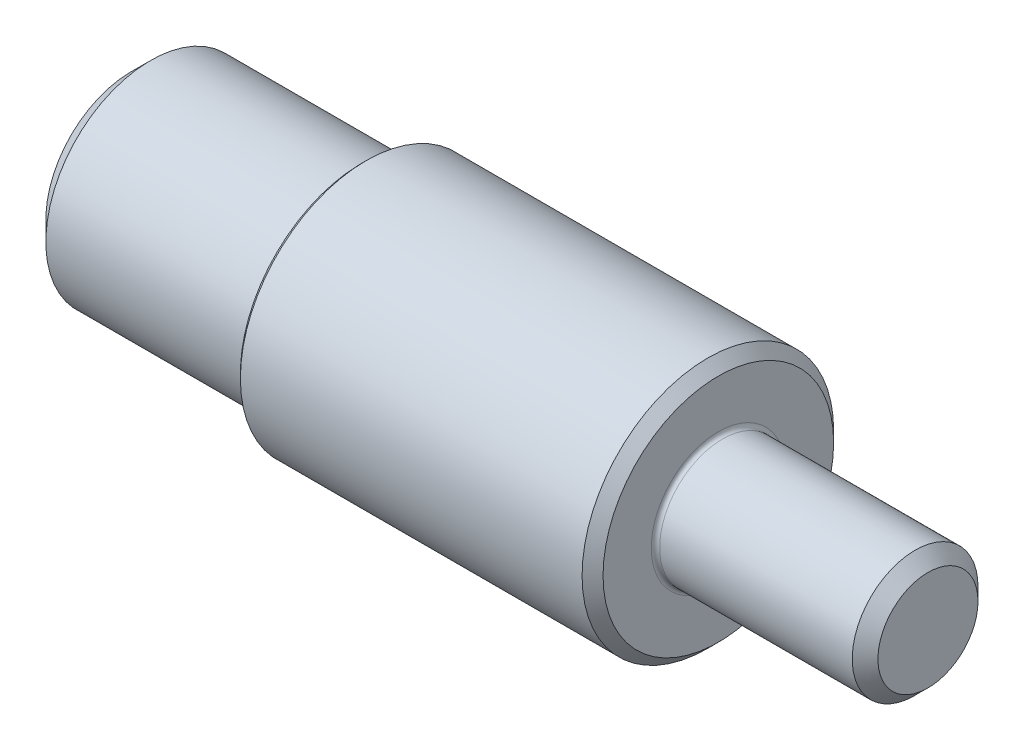
ISO-10303-21;
HEADER;
FILE_DESCRIPTION(('STEP AP214'),'2;1');
FILE_NAME('part.step','',(''),(''),'','','');
FILE_SCHEMA(('AUTOMOTIVE_DESIGN { 1 0 10303 214 1 1 1 1 }'));
ENDSEC;
DATA;
#1=APPLICATION_CONTEXT('core data for automotive mechanical design processes');
#2=APPLICATION_PROTOCOL_DEFINITION('international standard','automotive_design',2000,#1);
#3=PRODUCT_CONTEXT('',#1,'mechanical');
#4=PRODUCT('Part','Part','',(#3));
#5=PRODUCT_RELATED_PRODUCT_CATEGORY('part','',(#4));
#6=PRODUCT_DEFINITION_FORMATION('','',#4);
#7=PRODUCT_DEFINITION_CONTEXT('part definition',#1,'design');
#8=PRODUCT_DEFINITION('design','',#6,#7);
#9=PRODUCT_DEFINITION_SHAPE('','',#8);
#10=(LENGTH_UNIT() NAMED_UNIT(*) SI_UNIT(.MILLI.,.METRE.));
#11=(NAMED_UNIT(*) PLANE_ANGLE_UNIT() SI_UNIT($,.RADIAN.));
#12=(NAMED_UNIT(*) SI_UNIT($,.STERADIAN.) SOLID_ANGLE_UNIT());
#13=UNCERTAINTY_MEASURE_WITH_UNIT(LENGTH_MEASURE(1.E-05),#10,'distance_accuracy_value','');
#14=(GEOMETRIC_REPRESENTATION_CONTEXT(3) GLOBAL_UNCERTAINTY_ASSIGNED_CONTEXT((#13)) GLOBAL_UNIT_ASSIGNED_CONTEXT((#10,
#11,#12)) REPRESENTATION_CONTEXT('',''));
#15=CARTESIAN_POINT('',(0.,0.,0.));
#16=DIRECTION('',(0.,0.,1.));
#17=DIRECTION('',(1.,0.,0.));
#18=AXIS2_PLACEMENT_3D('',#15,#16,#17);
#19=CARTESIAN_POINT('',(-10.0800000000806,0.,0.));
#20=DIRECTION('',(1.,0.,0.));
#21=DIRECTION('',(0.,0.,-1.));
#22=AXIS2_PLACEMENT_3D('',#19,#20,#21);
#23=CONICAL_SURFACE('',#22,4.99999999998795,0.785398163397448);
#24=CARTESIAN_POINT('',(-11.0000000000241,0.,0.));
#25=DIRECTION('',(1.,0.,0.));
#26=DIRECTION('',(0.,0.,-1.));
#27=AXIS2_PLACEMENT_3D('',#24,#25,#26);
#28=CIRCLE('',#27,4.08000000004449);
#29=CARTESIAN_POINT('',(-11.0000000000241,0.,-4.08000000004449));
#30=VERTEX_POINT('',#29);
#31=EDGE_CURVE('E70',#30,#30,#28,.T.);
#32=ORIENTED_EDGE('',*,*,#31,.T.);
#33=EDGE_LOOP('',(#32));
#34=FACE_BOUND('',#33,.T.);
#35=CARTESIAN_POINT('',(-10.0800000000806,0.,0.));
#36=DIRECTION('',(1.,0.,0.));
#37=DIRECTION('',(0.,0.,-1.));
#38=AXIS2_PLACEMENT_3D('',#35,#36,#37);
#39=CIRCLE('',#38,4.99999999998795);
#40=CARTESIAN_POINT('',(-10.0800000000806,0.,-4.99999999998795));
#41=VERTEX_POINT('',#40);
#42=EDGE_CURVE('E10',#41,#41,#39,.T.);
#43=ORIENTED_EDGE('',*,*,#42,.F.);
#44=EDGE_LOOP('',(#43));
#45=FACE_BOUND('',#44,.T.);
#46=ADVANCED_FACE('F30',(#34,#45),#23,.T.);
#47=CARTESIAN_POINT('',(-11.0000000000241,0.,0.));
#48=DIRECTION('',(1.,0.,0.));
#49=DIRECTION('',(0.,0.,-1.));
#50=AXIS2_PLACEMENT_3D('',#47,#48,#49);
#51=CYLINDRICAL_SURFACE('',#50,4.99999999998795);
#52=ORIENTED_EDGE('',*,*,#42,.T.);
#53=EDGE_LOOP('',(#52));
#54=FACE_BOUND('',#53,.T.);
#55=CARTESIAN_POINT('',(-0.200000000012046,0.,0.));
#56=DIRECTION('',(1.,0.,0.));
#57=DIRECTION('',(0.,0.,-1.));
#58=AXIS2_PLACEMENT_3D('',#55,#56,#57);
#59=CIRCLE('',#58,4.99999999998795);
#60=CARTESIAN_POINT('',(-0.200000000012046,0.,-4.99999999998795));
#61=VERTEX_POINT('',#60);
#62=EDGE_CURVE('E36',#61,#61,#59,.T.);
#63=ORIENTED_EDGE('',*,*,#62,.F.);
#64=EDGE_LOOP('',(#63));
#65=FACE_BOUND('',#64,.T.);
#66=ADVANCED_FACE('F87',(#54,#65),#51,.T.);
#67=CARTESIAN_POINT('',(-0.200000000012046,0.,0.));
#68=DIRECTION('',(1.,0.,0.));
#69=DIRECTION('',(0.,0.,-1.));
#70=AXIS2_PLACEMENT_3D('',#67,#68,#69);
#71=TOROIDAL_SURFACE('',#70,5.19999999998795,0.199999999999998);
#72=ORIENTED_EDGE('',*,*,#62,.T.);
#73=EDGE_LOOP('',(#72));
#74=FACE_BOUND('',#73,.T.);
#75=CARTESIAN_POINT('',(-1.20493892641349E-11,0.,0.));
#76=DIRECTION('',(1.,0.,0.));
#77=DIRECTION('',(0.,0.,-1.));
#78=AXIS2_PLACEMENT_3D('',#75,#76,#77);
#79=CIRCLE('',#78,5.19999999998795);
#80=CARTESIAN_POINT('',(-1.20493892641349E-11,0.,-5.19999999998795));
#81=VERTEX_POINT('',#80);
#82=EDGE_CURVE('E40',#81,#81,#79,.T.);
#83=ORIENTED_EDGE('',*,*,#82,.F.);
#84=EDGE_LOOP('',(#83));
#85=FACE_BOUND('',#84,.T.);
#86=ADVANCED_FACE('F91',(#74,#85),#71,.F.);
#87=CARTESIAN_POINT('',(-1.20485885415211E-11,5.80000000000996,0.));
#88=DIRECTION('',(-1.,0.,0.));
#89=DIRECTION('',(0.,0.,1.));
#90=AXIS2_PLACEMENT_3D('',#87,#88,#89);
#91=PLANE('',#90);
#92=ORIENTED_EDGE('',*,*,#82,.T.);
#93=EDGE_LOOP('',(#92));
#94=FACE_BOUND('',#93,.T.);
#95=CARTESIAN_POINT('',(-1.20493892641349E-11,0.,0.));
#96=DIRECTION('',(1.,0.,0.));
#97=DIRECTION('',(0.,0.,-1.));
#98=AXIS2_PLACEMENT_3D('',#95,#96,#97);
#99=CIRCLE('',#98,5.80000000000996);
#100=CARTESIAN_POINT('',(-1.20493892641349E-11,0.,-5.80000000000996));
#101=VERTEX_POINT('',#100);
#102=EDGE_CURVE('E44',#101,#101,#99,.T.);
#103=ORIENTED_EDGE('',*,*,#102,.F.);
#104=EDGE_LOOP('',(#103));
#105=FACE_BOUND('',#104,.T.);
#106=ADVANCED_FACE('F95',(#94,#105),#91,.T.);
#107=CARTESIAN_POINT('',(0.199999999965941,0.,0.));
#108=DIRECTION('',(1.,0.,0.));
#109=DIRECTION('',(0.,0.,-1.));
#110=AXIS2_PLACEMENT_3D('',#107,#108,#109);
#111=CONICAL_SURFACE('',#110,5.99999999998795,0.785398163397448);
#112=ORIENTED_EDGE('',*,*,#102,.T.);
#113=EDGE_LOOP('',(#112));
#114=FACE_BOUND('',#113,.T.);
#115=CARTESIAN_POINT('',(0.199999999965941,0.,0.));
#116=DIRECTION('',(1.,0.,0.));
#117=DIRECTION('',(0.,0.,-1.));
#118=AXIS2_PLACEMENT_3D('',#115,#116,#117);
#119=CIRCLE('',#118,5.99999999998795);
#120=CARTESIAN_POINT('',(0.199999999965941,0.,-5.99999999998795));
#121=VERTEX_POINT('',#120);
#122=EDGE_CURVE('E49',#121,#121,#119,.T.);
#123=ORIENTED_EDGE('',*,*,#122,.F.);
#124=EDGE_LOOP('',(#123));
#125=FACE_BOUND('',#124,.T.);
#126=ADVANCED_FACE('F101',(#114,#125),#111,.T.);
#127=CARTESIAN_POINT('',(-11.0000000000241,0.,0.));
#128=DIRECTION('',(1.,0.,0.));
#129=DIRECTION('',(0.,0.,-1.));
#130=AXIS2_PLACEMENT_3D('',#127,#128,#129);
#131=CYLINDRICAL_SURFACE('',#130,5.99999999998795);
#132=ORIENTED_EDGE('',*,*,#122,.T.);
#133=EDGE_LOOP('',(#132));
#134=FACE_BOUND('',#133,.T.);
#135=CARTESIAN_POINT('',(16.499999999988,0.,0.));
#136=DIRECTION('',(1.,0.,0.));
#137=DIRECTION('',(0.,0.,-1.));
#138=AXIS2_PLACEMENT_3D('',#135,#136,#137);
#139=CIRCLE('',#138,5.99999999998795);
#140=CARTESIAN_POINT('',(16.499999999988,0.,-5.99999999998795));
#141=VERTEX_POINT('',#140);
#142=EDGE_CURVE('E52',#141,#141,#139,.T.);
#143=ORIENTED_EDGE('',*,*,#142,.F.);
#144=EDGE_LOOP('',(#143));
#145=FACE_BOUND('',#144,.T.);
#146=ADVANCED_FACE('F105',(#134,#145),#131,.T.);
#147=CARTESIAN_POINT('',(16.9999999999554,0.,0.));
#148=DIRECTION('',(-1.,0.,0.));
#149=DIRECTION('',(0.,0.,1.));
#150=AXIS2_PLACEMENT_3D('',#147,#148,#149);
#151=CONICAL_SURFACE('',#150,5.50000000002047,0.785398163397448);
#152=ORIENTED_EDGE('',*,*,#142,.T.);
#153=EDGE_LOOP('',(#152));
#154=FACE_BOUND('',#153,.T.);
#155=CARTESIAN_POINT('',(16.9999999999554,0.,0.));
#156=DIRECTION('',(1.,0.,0.));
#157=DIRECTION('',(0.,0.,-1.));
#158=AXIS2_PLACEMENT_3D('',#155,#156,#157);
#159=CIRCLE('',#158,5.50000000002047);
#160=CARTESIAN_POINT('',(16.9999999999554,0.,-5.50000000002047));
#161=VERTEX_POINT('',#160);
#162=EDGE_CURVE('E55',#161,#161,#159,.T.);
#163=ORIENTED_EDGE('',*,*,#162,.F.);
#164=EDGE_LOOP('',(#163));
#165=FACE_BOUND('',#164,.T.);
#166=ADVANCED_FACE('F109',(#154,#165),#151,.T.);
#167=CARTESIAN_POINT('',(16.9999999999554,3.19999999997999,0.));
#168=DIRECTION('',(1.,0.,0.));
#169=DIRECTION('',(0.,0.,-1.));
#170=AXIS2_PLACEMENT_3D('',#167,#168,#169);
#171=PLANE('',#170);
#172=ORIENTED_EDGE('',*,*,#162,.T.);
#173=EDGE_LOOP('',(#172));
#174=FACE_BOUND('',#173,.T.);
#175=CARTESIAN_POINT('',(16.9999999999554,0.,0.));
#176=DIRECTION('',(1.,0.,0.));
#177=DIRECTION('',(0.,0.,-1.));
#178=AXIS2_PLACEMENT_3D('',#175,#176,#177);
#179=CIRCLE('',#178,3.19999999997999);
#180=CARTESIAN_POINT('',(16.9999999999554,0.,-3.19999999997999));
#181=VERTEX_POINT('',#180);
#182=EDGE_CURVE('E58',#181,#181,#179,.T.);
#183=ORIENTED_EDGE('',*,*,#182,.F.);
#184=EDGE_LOOP('',(#183));
#185=FACE_BOUND('',#184,.T.);
#186=ADVANCED_FACE('F113',(#174,#185),#171,.T.);
#187=CARTESIAN_POINT('',(17.1999999999554,0.,0.));
#188=DIRECTION('',(1.,0.,0.));
#189=DIRECTION('',(0.,0.,-1.));
#190=AXIS2_PLACEMENT_3D('',#187,#188,#189);
#191=TOROIDAL_SURFACE('',#190,3.19999999997999,0.200000000000002);
#192=ORIENTED_EDGE('',*,*,#182,.T.);
#193=EDGE_LOOP('',(#192));
#194=FACE_BOUND('',#193,.T.);
#195=CARTESIAN_POINT('',(17.1999999999554,0.,0.));
#196=DIRECTION('',(1.,0.,0.));
#197=DIRECTION('',(0.,0.,-1.));
#198=AXIS2_PLACEMENT_3D('',#195,#196,#197);
#199=CIRCLE('',#198,2.99999999997999);
#200=CARTESIAN_POINT('',(17.1999999999554,0.,-2.99999999997999));
#201=VERTEX_POINT('',#200);
#202=EDGE_CURVE('E61',#201,#201,#199,.T.);
#203=ORIENTED_EDGE('',*,*,#202,.F.);
#204=EDGE_LOOP('',(#203));
#205=FACE_BOUND('',#204,.T.);
#206=ADVANCED_FACE('F117',(#194,#205),#191,.F.);
#207=CARTESIAN_POINT('',(-11.0000000000241,0.,0.));
#208=DIRECTION('',(1.,0.,0.));
#209=DIRECTION('',(0.,0.,-1.));
#210=AXIS2_PLACEMENT_3D('',#207,#208,#209);
#211=CYLINDRICAL_SURFACE('',#210,2.99999999997999);
#212=ORIENTED_EDGE('',*,*,#202,.T.);
#213=EDGE_LOOP('',(#212));
#214=FACE_BOUND('',#213,.T.);
#215=CARTESIAN_POINT('',(26.3864999999554,0.,0.));
#216=DIRECTION('',(1.,0.,0.));
#217=DIRECTION('',(0.,0.,-1.));
#218=AXIS2_PLACEMENT_3D('',#215,#216,#217);
#219=CIRCLE('',#218,2.99999999997999);
#220=CARTESIAN_POINT('',(26.3864999999554,0.,-2.99999999997999));
#221=VERTEX_POINT('',#220);
#222=EDGE_CURVE('E64',#221,#221,#219,.T.);
#223=ORIENTED_EDGE('',*,*,#222,.F.);
#224=EDGE_LOOP('',(#223));
#225=FACE_BOUND('',#224,.T.);
#226=ADVANCED_FACE('F121',(#214,#225),#211,.T.);
#227=CARTESIAN_POINT('',(26.9999999999488,0.,0.));
#228=DIRECTION('',(-1.,0.,0.));
#229=DIRECTION('',(0.,0.,1.));
#230=AXIS2_PLACEMENT_3D('',#227,#228,#229);
#231=CONICAL_SURFACE('',#230,2.38649999998659,0.785398163397443);
#232=ORIENTED_EDGE('',*,*,#222,.T.);
#233=EDGE_LOOP('',(#232));
#234=FACE_BOUND('',#233,.T.);
#235=CARTESIAN_POINT('',(26.9999999999488,0.,0.));
#236=DIRECTION('',(1.,0.,0.));
#237=DIRECTION('',(0.,0.,-1.));
#238=AXIS2_PLACEMENT_3D('',#235,#236,#237);
#239=CIRCLE('',#238,2.38649999998659);
#240=CARTESIAN_POINT('',(26.9999999999488,0.,-2.38649999998659));
#241=VERTEX_POINT('',#240);
#242=EDGE_CURVE('E67',#241,#241,#239,.T.);
#243=ORIENTED_EDGE('',*,*,#242,.F.);
#244=EDGE_LOOP('',(#243));
#245=FACE_BOUND('',#244,.T.);
#246=ADVANCED_FACE('F83',(#234,#245),#231,.T.);
#247=CARTESIAN_POINT('',(26.9999999999488,0.,0.));
#248=DIRECTION('',(1.,0.,0.));
#249=DIRECTION('',(0.,0.,-1.));
#250=AXIS2_PLACEMENT_3D('',#247,#248,#249);
#251=PLANE('',#250);
#252=ORIENTED_EDGE('',*,*,#242,.T.);
#253=EDGE_LOOP('',(#252));
#254=FACE_BOUND('',#253,.T.);
#255=ADVANCED_FACE('F78',(#254),#251,.T.);
#256=CARTESIAN_POINT('',(-11.0000000000241,4.08000000004449,0.));
#257=DIRECTION('',(-1.,0.,0.));
#258=DIRECTION('',(0.,0.,1.));
#259=AXIS2_PLACEMENT_3D('',#256,#257,#258);
#260=PLANE('',#259);
#261=ORIENTED_EDGE('',*,*,#31,.F.);
#262=EDGE_LOOP('',(#261));
#263=FACE_BOUND('',#262,.T.);
#264=ADVANCED_FACE('F76',(#263),#260,.T.);
#265=CLOSED_SHELL('',(#46,#66,#86,#106,#126,#146,#166,#186,#206,#226,#246,#255,#264));
#266=MANIFOLD_SOLID_BREP('B2',#265);
#267=ADVANCED_BREP_SHAPE_REPRESENTATION('',(#18,#266),#14);
#268=SHAPE_DEFINITION_REPRESENTATION(#9,#267);
ENDSEC;
END-ISO-10303-21;
